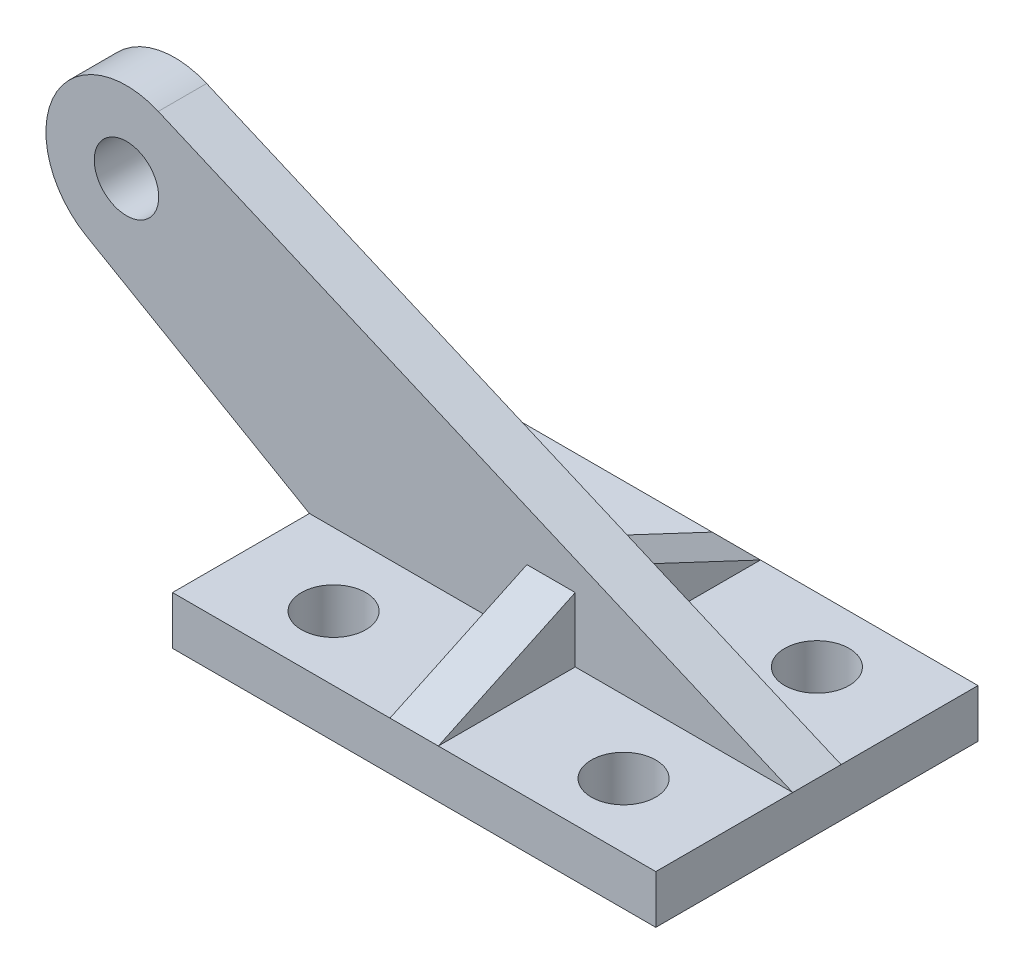
ISO-10303-21;
HEADER;
FILE_DESCRIPTION(('STEP AP214'),'2;1');
FILE_NAME('part.step','',(''),(''),'','','');
FILE_SCHEMA(('AUTOMOTIVE_DESIGN { 1 0 10303 214 1 1 1 1 }'));
ENDSEC;
DATA;
#1=APPLICATION_CONTEXT('core data for automotive mechanical design processes');
#2=APPLICATION_PROTOCOL_DEFINITION('international standard','automotive_design',2000,#1);
#3=PRODUCT_CONTEXT('',#1,'mechanical');
#4=PRODUCT('Part','Part','',(#3));
#5=PRODUCT_RELATED_PRODUCT_CATEGORY('part','',(#4));
#6=PRODUCT_DEFINITION_FORMATION('','',#4);
#7=PRODUCT_DEFINITION_CONTEXT('part definition',#1,'design');
#8=PRODUCT_DEFINITION('design','',#6,#7);
#9=PRODUCT_DEFINITION_SHAPE('','',#8);
#10=(LENGTH_UNIT() NAMED_UNIT(*) SI_UNIT(.MILLI.,.METRE.));
#11=(NAMED_UNIT(*) PLANE_ANGLE_UNIT() SI_UNIT($,.RADIAN.));
#12=(NAMED_UNIT(*) SI_UNIT($,.STERADIAN.) SOLID_ANGLE_UNIT());
#13=UNCERTAINTY_MEASURE_WITH_UNIT(LENGTH_MEASURE(1.E-05),#10,'distance_accuracy_value','');
#14=(GEOMETRIC_REPRESENTATION_CONTEXT(3) GLOBAL_UNCERTAINTY_ASSIGNED_CONTEXT((#13)) GLOBAL_UNIT_ASSIGNED_CONTEXT((#10,
#11,#12)) REPRESENTATION_CONTEXT('',''));
#15=CARTESIAN_POINT('',(0.,0.,0.));
#16=DIRECTION('',(0.,0.,1.));
#17=DIRECTION('',(1.,0.,0.));
#18=AXIS2_PLACEMENT_3D('',#15,#16,#17);
#19=CARTESIAN_POINT('',(0.,15.,0.));
#20=DIRECTION('',(0.,-1.,0.));
#21=DIRECTION('',(0.,0.,-1.));
#22=AXIS2_PLACEMENT_3D('',#19,#20,#21);
#23=PLANE('',#22);
#24=CARTESIAN_POINT('',(45.,15.,-30.));
#25=DIRECTION('',(0.,1.,0.));
#26=DIRECTION('',(0.,0.,1.));
#27=AXIS2_PLACEMENT_3D('',#24,#25,#26);
#28=CIRCLE('',#27,10.);
#29=CARTESIAN_POINT('',(45.,15.,-20.));
#30=VERTEX_POINT('',#29);
#31=EDGE_CURVE('E302',#30,#30,#28,.T.);
#32=ORIENTED_EDGE('',*,*,#31,.F.);
#33=EDGE_LOOP('',(#32));
#34=FACE_BOUND('',#33,.T.);
#35=DIRECTION('',(0.,0.,-1.));
#36=VECTOR('',#35,1.);
#37=CARTESIAN_POINT('',(7.5,15.,-7.5));
#38=LINE('',#37,#36);
#39=CARTESIAN_POINT('',(7.5,15.,-7.5));
#40=VERTEX_POINT('',#39);
#41=CARTESIAN_POINT('',(7.5,15.,-50.));
#42=VERTEX_POINT('',#41);
#43=EDGE_CURVE('E158',#40,#42,#38,.T.);
#44=ORIENTED_EDGE('',*,*,#43,.F.);
#45=DIRECTION('',(1.,0.,0.));
#46=VECTOR('',#45,1.);
#47=CARTESIAN_POINT('',(75.,15.,-7.5));
#48=LINE('',#47,#46);
#49=CARTESIAN_POINT('',(75.,15.,-7.5));
#50=VERTEX_POINT('',#49);
#51=EDGE_CURVE('E277',#40,#50,#48,.T.);
#52=ORIENTED_EDGE('',*,*,#51,.T.);
#53=DIRECTION('',(0.,0.,-1.));
#54=VECTOR('',#53,1.);
#55=CARTESIAN_POINT('',(75.,15.,50.));
#56=LINE('',#55,#54);
#57=CARTESIAN_POINT('',(75.,15.,-50.));
#58=VERTEX_POINT('',#57);
#59=EDGE_CURVE('E178',#50,#58,#56,.T.);
#60=ORIENTED_EDGE('',*,*,#59,.T.);
#61=DIRECTION('',(-1.,0.,0.));
#62=VECTOR('',#61,1.);
#63=CARTESIAN_POINT('',(-75.,15.,-50.));
#64=LINE('',#63,#62);
#65=EDGE_CURVE('E171',#58,#42,#64,.T.);
#66=ORIENTED_EDGE('',*,*,#65,.T.);
#67=EDGE_LOOP('',(#44,#52,#60,#66));
#68=FACE_BOUND('',#67,.T.);
#69=ADVANCED_FACE('F45',(#34,#68),#23,.F.);
#70=CARTESIAN_POINT('',(-131.782032302755,76.650635094611,-7.5));
#71=DIRECTION('',(0.,0.,1.));
#72=DIRECTION('',(1.,0.,0.));
#73=AXIS2_PLACEMENT_3D('',#70,#71,#72);
#74=PLANE('',#73);
#75=CARTESIAN_POINT('',(-131.782032302755,76.650635094611,-7.5));
#76=DIRECTION('',(0.,0.,1.));
#77=DIRECTION('',(1.,0.,0.));
#78=AXIS2_PLACEMENT_3D('',#75,#76,#77);
#79=CIRCLE('',#78,9.99999999999999);
#80=CARTESIAN_POINT('',(-121.782032302755,76.650635094611,-7.5));
#81=VERTEX_POINT('',#80);
#82=EDGE_CURVE('E247',#81,#81,#79,.T.);
#83=ORIENTED_EDGE('',*,*,#82,.T.);
#84=EDGE_LOOP('',(#83));
#85=FACE_BOUND('',#84,.T.);
#86=DIRECTION('',(0.,-1.,0.));
#87=VECTOR('',#86,1.);
#88=CARTESIAN_POINT('',(7.5,35.,-7.5));
#89=LINE('',#88,#87);
#90=CARTESIAN_POINT('',(7.5,35.,-7.5));
#91=VERTEX_POINT('',#90);
#92=EDGE_CURVE('E157',#91,#40,#89,.T.);
#93=ORIENTED_EDGE('',*,*,#92,.F.);
#94=DIRECTION('',(-1.,0.,0.));
#95=VECTOR('',#94,1.);
#96=CARTESIAN_POINT('',(7.5,35.,-7.5));
#97=LINE('',#96,#95);
#98=CARTESIAN_POINT('',(-7.5,35.,-7.5));
#99=VERTEX_POINT('',#98);
#100=EDGE_CURVE('E154',#91,#99,#97,.T.);
#101=ORIENTED_EDGE('',*,*,#100,.T.);
#102=DIRECTION('',(0.,-1.,0.));
#103=VECTOR('',#102,1.);
#104=CARTESIAN_POINT('',(-7.5,35.,-7.5));
#105=LINE('',#104,#103);
#106=CARTESIAN_POINT('',(-7.50000000000001,15.,-7.5));
#107=VERTEX_POINT('',#106);
#108=EDGE_CURVE('E165',#99,#107,#105,.T.);
#109=ORIENTED_EDGE('',*,*,#108,.T.);
#110=CARTESIAN_POINT('',(-75.,15.,-7.5));
#111=VERTEX_POINT('',#110);
#112=EDGE_CURVE('E263',#111,#107,#48,.T.);
#113=ORIENTED_EDGE('',*,*,#112,.F.);
#114=DIRECTION('',(0.866025403784438,-0.500000000000001,0.));
#115=VECTOR('',#114,1.);
#116=CARTESIAN_POINT('',(-75.,15.,-7.5));
#117=LINE('',#116,#115);
#118=CARTESIAN_POINT('',(-144.282032302755,55.0000000000001,-7.5));
#119=VERTEX_POINT('',#118);
#120=EDGE_CURVE('E274',#119,#111,#117,.T.);
#121=ORIENTED_EDGE('',*,*,#120,.F.);
#122=CARTESIAN_POINT('',(-131.782032302755,76.650635094611,-7.5));
#123=DIRECTION('',(0.,0.,1.));
#124=DIRECTION('',(1.,0.,0.));
#125=AXIS2_PLACEMENT_3D('',#122,#123,#124);
#126=CIRCLE('',#125,25.);
#127=CARTESIAN_POINT('',(-121.911493446378,99.6195807100445,-7.5));
#128=VERTEX_POINT('',#127);
#129=EDGE_CURVE('E272',#128,#119,#126,.T.);
#130=ORIENTED_EDGE('',*,*,#129,.F.);
#131=DIRECTION('',(-0.91875782461734,0.394821554255101,0.));
#132=VECTOR('',#131,1.);
#133=CARTESIAN_POINT('',(-121.911493446378,99.6195807100445,-7.5));
#134=LINE('',#133,#132);
#135=EDGE_CURVE('E257',#50,#128,#134,.T.);
#136=ORIENTED_EDGE('',*,*,#135,.F.);
#137=ORIENTED_EDGE('',*,*,#51,.F.);
#138=EDGE_LOOP('',(#93,#101,#109,#113,#121,#130,#136,#137));
#139=FACE_BOUND('',#138,.T.);
#140=ADVANCED_FACE('F328',(#85,#139),#74,.F.);
#141=CARTESIAN_POINT('',(45.,15.,30.));
#142=DIRECTION('',(0.,1.,0.));
#143=DIRECTION('',(0.,0.,1.));
#144=AXIS2_PLACEMENT_3D('',#141,#142,#143);
#145=CIRCLE('',#144,9.99999999999999);
#146=CARTESIAN_POINT('',(45.,15.,40.));
#147=VERTEX_POINT('',#146);
#148=EDGE_CURVE('E296',#147,#147,#145,.T.);
#149=ORIENTED_EDGE('',*,*,#148,.F.);
#150=EDGE_LOOP('',(#149));
#151=FACE_BOUND('',#150,.T.);
#152=DIRECTION('',(0.,0.,-1.));
#153=VECTOR('',#152,1.);
#154=CARTESIAN_POINT('',(7.5,15.,7.5));
#155=LINE('',#154,#153);
#156=CARTESIAN_POINT('',(7.49999999999999,15.,50.));
#157=VERTEX_POINT('',#156);
#158=CARTESIAN_POINT('',(7.50000000000001,15.,7.5));
#159=VERTEX_POINT('',#158);
#160=EDGE_CURVE('E68',#157,#159,#155,.T.);
#161=ORIENTED_EDGE('',*,*,#160,.F.);
#162=DIRECTION('',(1.,0.,0.));
#163=VECTOR('',#162,1.);
#164=CARTESIAN_POINT('',(-75.,15.,50.));
#165=LINE('',#164,#163);
#166=CARTESIAN_POINT('',(75.,15.,50.));
#167=VERTEX_POINT('',#166);
#168=EDGE_CURVE('E188',#157,#167,#165,.T.);
#169=ORIENTED_EDGE('',*,*,#168,.T.);
#170=CARTESIAN_POINT('',(75.,15.,7.5));
#171=VERTEX_POINT('',#170);
#172=EDGE_CURVE('E183',#167,#171,#56,.T.);
#173=ORIENTED_EDGE('',*,*,#172,.T.);
#174=DIRECTION('',(1.,0.,0.));
#175=VECTOR('',#174,1.);
#176=CARTESIAN_POINT('',(75.,15.,7.5));
#177=LINE('',#176,#175);
#178=EDGE_CURVE('E230',#159,#171,#177,.T.);
#179=ORIENTED_EDGE('',*,*,#178,.F.);
#180=EDGE_LOOP('',(#161,#169,#173,#179));
#181=FACE_BOUND('',#180,.T.);
#182=ADVANCED_FACE('F229',(#151,#181),#23,.F.);
#183=CARTESIAN_POINT('',(-131.782032302755,76.650635094611,7.5));
#184=DIRECTION('',(0.,0.,1.));
#185=DIRECTION('',(1.,0.,0.));
#186=AXIS2_PLACEMENT_3D('',#183,#184,#185);
#187=PLANE('',#186);
#188=CARTESIAN_POINT('',(-131.782032302755,76.650635094611,7.5));
#189=DIRECTION('',(0.,0.,1.));
#190=DIRECTION('',(1.,0.,0.));
#191=AXIS2_PLACEMENT_3D('',#188,#189,#190);
#192=CIRCLE('',#191,9.99999999999999);
#193=CARTESIAN_POINT('',(-121.782032302755,76.650635094611,7.5));
#194=VERTEX_POINT('',#193);
#195=EDGE_CURVE('E251',#194,#194,#192,.T.);
#196=ORIENTED_EDGE('',*,*,#195,.F.);
#197=EDGE_LOOP('',(#196));
#198=FACE_BOUND('',#197,.T.);
#199=DIRECTION('',(-1.,0.,0.));
#200=VECTOR('',#199,1.);
#201=CARTESIAN_POINT('',(7.5,35.,7.5));
#202=LINE('',#201,#200);
#203=CARTESIAN_POINT('',(7.50000000000001,35.,7.5));
#204=VERTEX_POINT('',#203);
#205=CARTESIAN_POINT('',(-7.50000000000001,35.,7.5));
#206=VERTEX_POINT('',#205);
#207=EDGE_CURVE('E248',#204,#206,#202,.T.);
#208=ORIENTED_EDGE('',*,*,#207,.F.);
#209=DIRECTION('',(0.,1.,0.));
#210=VECTOR('',#209,1.);
#211=CARTESIAN_POINT('',(7.5,35.,7.5));
#212=LINE('',#211,#210);
#213=EDGE_CURVE('E239',#159,#204,#212,.T.);
#214=ORIENTED_EDGE('',*,*,#213,.F.);
#215=ORIENTED_EDGE('',*,*,#178,.T.);
#216=DIRECTION('',(-0.91875782461734,0.394821554255101,0.));
#217=VECTOR('',#216,1.);
#218=CARTESIAN_POINT('',(-121.911493446378,99.6195807100445,7.5));
#219=LINE('',#218,#217);
#220=CARTESIAN_POINT('',(-121.911493446378,99.6195807100445,7.5));
#221=VERTEX_POINT('',#220);
#222=EDGE_CURVE('E259',#171,#221,#219,.T.);
#223=ORIENTED_EDGE('',*,*,#222,.T.);
#224=CARTESIAN_POINT('',(-131.782032302755,76.650635094611,7.5));
#225=DIRECTION('',(0.,0.,1.));
#226=DIRECTION('',(1.,0.,0.));
#227=AXIS2_PLACEMENT_3D('',#224,#225,#226);
#228=CIRCLE('',#227,25.);
#229=CARTESIAN_POINT('',(-144.282032302755,55.0000000000001,7.5));
#230=VERTEX_POINT('',#229);
#231=EDGE_CURVE('E262',#221,#230,#228,.T.);
#232=ORIENTED_EDGE('',*,*,#231,.T.);
#233=DIRECTION('',(0.866025403784438,-0.500000000000001,0.));
#234=VECTOR('',#233,1.);
#235=CARTESIAN_POINT('',(-75.,15.,7.5));
#236=LINE('',#235,#234);
#237=CARTESIAN_POINT('',(-75.,15.,7.5));
#238=VERTEX_POINT('',#237);
#239=EDGE_CURVE('E265',#230,#238,#236,.T.);
#240=ORIENTED_EDGE('',*,*,#239,.T.);
#241=CARTESIAN_POINT('',(-7.5,15.,7.5));
#242=VERTEX_POINT('',#241);
#243=EDGE_CURVE('E268',#238,#242,#177,.T.);
#244=ORIENTED_EDGE('',*,*,#243,.T.);
#245=DIRECTION('',(0.,1.,0.));
#246=VECTOR('',#245,1.);
#247=CARTESIAN_POINT('',(-7.5,35.,7.5));
#248=LINE('',#247,#246);
#249=EDGE_CURVE('E242',#242,#206,#248,.T.);
#250=ORIENTED_EDGE('',*,*,#249,.T.);
#251=EDGE_LOOP('',(#208,#214,#215,#223,#232,#240,#244,#250));
#252=FACE_BOUND('',#251,.T.);
#253=ADVANCED_FACE('F339',(#198,#252),#187,.T.);
#254=CARTESIAN_POINT('',(-45.,15.,30.));
#255=DIRECTION('',(0.,1.,0.));
#256=DIRECTION('',(0.,0.,1.));
#257=AXIS2_PLACEMENT_3D('',#254,#255,#256);
#258=CIRCLE('',#257,10.);
#259=CARTESIAN_POINT('',(-45.,15.,40.));
#260=VERTEX_POINT('',#259);
#261=EDGE_CURVE('E290',#260,#260,#258,.T.);
#262=ORIENTED_EDGE('',*,*,#261,.F.);
#263=EDGE_LOOP('',(#262));
#264=FACE_BOUND('',#263,.T.);
#265=CARTESIAN_POINT('',(-75.,15.,50.));
#266=VERTEX_POINT('',#265);
#267=CARTESIAN_POINT('',(-7.49999999999999,15.,50.));
#268=VERTEX_POINT('',#267);
#269=EDGE_CURVE('E189',#266,#268,#165,.T.);
#270=ORIENTED_EDGE('',*,*,#269,.T.);
#271=DIRECTION('',(0.,0.,-1.));
#272=VECTOR('',#271,1.);
#273=CARTESIAN_POINT('',(-7.5,15.,7.5));
#274=LINE('',#273,#272);
#275=EDGE_CURVE('E364',#268,#242,#274,.T.);
#276=ORIENTED_EDGE('',*,*,#275,.T.);
#277=ORIENTED_EDGE('',*,*,#243,.F.);
#278=DIRECTION('',(0.,0.,1.));
#279=VECTOR('',#278,1.);
#280=CARTESIAN_POINT('',(-75.,15.,50.));
#281=LINE('',#280,#279);
#282=EDGE_CURVE('E179',#238,#266,#281,.T.);
#283=ORIENTED_EDGE('',*,*,#282,.T.);
#284=EDGE_LOOP('',(#270,#276,#277,#283));
#285=FACE_BOUND('',#284,.T.);
#286=ADVANCED_FACE('F341',(#264,#285),#23,.F.);
#287=ORIENTED_EDGE('',*,*,#112,.T.);
#288=DIRECTION('',(0.,0.,-1.));
#289=VECTOR('',#288,1.);
#290=CARTESIAN_POINT('',(-7.5,15.,-7.5));
#291=LINE('',#290,#289);
#292=CARTESIAN_POINT('',(-7.5,15.,-50.));
#293=VERTEX_POINT('',#292);
#294=EDGE_CURVE('E60',#107,#293,#291,.T.);
#295=ORIENTED_EDGE('',*,*,#294,.T.);
#296=CARTESIAN_POINT('',(-75.,15.,-50.));
#297=VERTEX_POINT('',#296);
#298=EDGE_CURVE('E174',#293,#297,#64,.T.);
#299=ORIENTED_EDGE('',*,*,#298,.T.);
#300=EDGE_CURVE('E181',#297,#111,#281,.T.);
#301=ORIENTED_EDGE('',*,*,#300,.T.);
#302=EDGE_LOOP('',(#287,#295,#299,#301));
#303=FACE_BOUND('',#302,.T.);
#304=CARTESIAN_POINT('',(-45.,15.,-30.));
#305=DIRECTION('',(0.,1.,0.));
#306=DIRECTION('',(0.,0.,1.));
#307=AXIS2_PLACEMENT_3D('',#304,#305,#306);
#308=CIRCLE('',#307,10.);
#309=CARTESIAN_POINT('',(-45.,15.,-20.));
#310=VERTEX_POINT('',#309);
#311=EDGE_CURVE('E197',#310,#310,#308,.T.);
#312=ORIENTED_EDGE('',*,*,#311,.F.);
#313=EDGE_LOOP('',(#312));
#314=FACE_BOUND('',#313,.T.);
#315=ADVANCED_FACE('F330',(#303,#314),#23,.F.);
#316=CARTESIAN_POINT('',(0.,0.,0.));
#317=DIRECTION('',(0.,-1.,0.));
#318=DIRECTION('',(0.,0.,-1.));
#319=AXIS2_PLACEMENT_3D('',#316,#317,#318);
#320=PLANE('',#319);
#321=CARTESIAN_POINT('',(45.,0.,30.));
#322=DIRECTION('',(0.,1.,0.));
#323=DIRECTION('',(0.,0.,1.));
#324=AXIS2_PLACEMENT_3D('',#321,#322,#323);
#325=CIRCLE('',#324,9.99999999999999);
#326=CARTESIAN_POINT('',(45.,0.,40.));
#327=VERTEX_POINT('',#326);
#328=EDGE_CURVE('E293',#327,#327,#325,.T.);
#329=ORIENTED_EDGE('',*,*,#328,.T.);
#330=EDGE_LOOP('',(#329));
#331=FACE_BOUND('',#330,.T.);
#332=CARTESIAN_POINT('',(-45.,0.,-30.));
#333=DIRECTION('',(0.,1.,0.));
#334=DIRECTION('',(0.,0.,1.));
#335=AXIS2_PLACEMENT_3D('',#332,#333,#334);
#336=CIRCLE('',#335,10.);
#337=CARTESIAN_POINT('',(-45.,0.,-20.));
#338=VERTEX_POINT('',#337);
#339=EDGE_CURVE('E305',#338,#338,#336,.T.);
#340=ORIENTED_EDGE('',*,*,#339,.T.);
#341=EDGE_LOOP('',(#340));
#342=FACE_BOUND('',#341,.T.);
#343=DIRECTION('',(0.,0.,-1.));
#344=VECTOR('',#343,1.);
#345=CARTESIAN_POINT('',(75.,0.,50.));
#346=LINE('',#345,#344);
#347=CARTESIAN_POINT('',(75.,0.,50.));
#348=VERTEX_POINT('',#347);
#349=CARTESIAN_POINT('',(75.,0.,-50.));
#350=VERTEX_POINT('',#349);
#351=EDGE_CURVE('E193',#348,#350,#346,.T.);
#352=ORIENTED_EDGE('',*,*,#351,.F.);
#353=DIRECTION('',(1.,0.,0.));
#354=VECTOR('',#353,1.);
#355=CARTESIAN_POINT('',(-75.,0.,50.));
#356=LINE('',#355,#354);
#357=CARTESIAN_POINT('',(-75.,0.,50.));
#358=VERTEX_POINT('',#357);
#359=EDGE_CURVE('E201',#358,#348,#356,.T.);
#360=ORIENTED_EDGE('',*,*,#359,.F.);
#361=DIRECTION('',(0.,0.,1.));
#362=VECTOR('',#361,1.);
#363=CARTESIAN_POINT('',(-75.,0.,50.));
#364=LINE('',#363,#362);
#365=CARTESIAN_POINT('',(-75.,0.,-50.));
#366=VERTEX_POINT('',#365);
#367=EDGE_CURVE('E199',#366,#358,#364,.T.);
#368=ORIENTED_EDGE('',*,*,#367,.F.);
#369=DIRECTION('',(-1.,0.,0.));
#370=VECTOR('',#369,1.);
#371=CARTESIAN_POINT('',(-75.,0.,-50.));
#372=LINE('',#371,#370);
#373=EDGE_CURVE('E196',#350,#366,#372,.T.);
#374=ORIENTED_EDGE('',*,*,#373,.F.);
#375=EDGE_LOOP('',(#352,#360,#368,#374));
#376=FACE_BOUND('',#375,.T.);
#377=CARTESIAN_POINT('',(45.,0.,-30.));
#378=DIRECTION('',(0.,1.,0.));
#379=DIRECTION('',(0.,0.,1.));
#380=AXIS2_PLACEMENT_3D('',#377,#378,#379);
#381=CIRCLE('',#380,10.);
#382=CARTESIAN_POINT('',(45.,0.,-20.));
#383=VERTEX_POINT('',#382);
#384=EDGE_CURVE('E299',#383,#383,#381,.T.);
#385=ORIENTED_EDGE('',*,*,#384,.T.);
#386=EDGE_LOOP('',(#385));
#387=FACE_BOUND('',#386,.T.);
#388=CARTESIAN_POINT('',(-45.,0.,30.));
#389=DIRECTION('',(0.,1.,0.));
#390=DIRECTION('',(0.,0.,1.));
#391=AXIS2_PLACEMENT_3D('',#388,#389,#390);
#392=CIRCLE('',#391,10.);
#393=CARTESIAN_POINT('',(-45.,0.,40.));
#394=VERTEX_POINT('',#393);
#395=EDGE_CURVE('E289',#394,#394,#392,.T.);
#396=ORIENTED_EDGE('',*,*,#395,.T.);
#397=EDGE_LOOP('',(#396));
#398=FACE_BOUND('',#397,.T.);
#399=ADVANCED_FACE('F216',(#331,#342,#376,#387,#398),#320,.T.);
#400=CARTESIAN_POINT('',(75.,15.,50.));
#401=DIRECTION('',(-1.,0.,0.));
#402=DIRECTION('',(0.,0.,1.));
#403=AXIS2_PLACEMENT_3D('',#400,#401,#402);
#404=PLANE('',#403);
#405=ORIENTED_EDGE('',*,*,#351,.T.);
#406=DIRECTION('',(0.,-1.,0.));
#407=VECTOR('',#406,1.);
#408=CARTESIAN_POINT('',(75.,15.,-50.));
#409=LINE('',#408,#407);
#410=EDGE_CURVE('E13',#58,#350,#409,.T.);
#411=ORIENTED_EDGE('',*,*,#410,.F.);
#412=ORIENTED_EDGE('',*,*,#59,.F.);
#413=DIRECTION('',(0.,0.,-1.));
#414=VECTOR('',#413,1.);
#415=CARTESIAN_POINT('',(75.,15.,7.5));
#416=LINE('',#415,#414);
#417=EDGE_CURVE('E227',#171,#50,#416,.T.);
#418=ORIENTED_EDGE('',*,*,#417,.F.);
#419=ORIENTED_EDGE('',*,*,#172,.F.);
#420=DIRECTION('',(0.,-1.,0.));
#421=VECTOR('',#420,1.);
#422=CARTESIAN_POINT('',(75.,15.,50.));
#423=LINE('',#422,#421);
#424=EDGE_CURVE('E192',#167,#348,#423,.T.);
#425=ORIENTED_EDGE('',*,*,#424,.T.);
#426=EDGE_LOOP('',(#405,#411,#412,#418,#419,#425));
#427=FACE_BOUND('',#426,.T.);
#428=ADVANCED_FACE('F47',(#427),#404,.F.);
#429=CARTESIAN_POINT('',(-75.,15.,-50.));
#430=DIRECTION('',(0.,0.,1.));
#431=DIRECTION('',(1.,0.,0.));
#432=AXIS2_PLACEMENT_3D('',#429,#430,#431);
#433=PLANE('',#432);
#434=ORIENTED_EDGE('',*,*,#373,.T.);
#435=DIRECTION('',(0.,-1.,0.));
#436=VECTOR('',#435,1.);
#437=CARTESIAN_POINT('',(-75.,15.,-50.));
#438=LINE('',#437,#436);
#439=EDGE_CURVE('E53',#297,#366,#438,.T.);
#440=ORIENTED_EDGE('',*,*,#439,.F.);
#441=ORIENTED_EDGE('',*,*,#298,.F.);
#442=DIRECTION('',(-1.,0.,0.));
#443=VECTOR('',#442,1.);
#444=CARTESIAN_POINT('',(7.5,15.,-50.));
#445=LINE('',#444,#443);
#446=EDGE_CURVE('E152',#42,#293,#445,.T.);
#447=ORIENTED_EDGE('',*,*,#446,.F.);
#448=ORIENTED_EDGE('',*,*,#65,.F.);
#449=ORIENTED_EDGE('',*,*,#410,.T.);
#450=EDGE_LOOP('',(#434,#440,#441,#447,#448,#449));
#451=FACE_BOUND('',#450,.T.);
#452=ADVANCED_FACE('F170',(#451),#433,.F.);
#453=CARTESIAN_POINT('',(-75.,15.,50.));
#454=DIRECTION('',(1.,0.,0.));
#455=DIRECTION('',(0.,0.,-1.));
#456=AXIS2_PLACEMENT_3D('',#453,#454,#455);
#457=PLANE('',#456);
#458=ORIENTED_EDGE('',*,*,#367,.T.);
#459=DIRECTION('',(0.,-1.,0.));
#460=VECTOR('',#459,1.);
#461=CARTESIAN_POINT('',(-75.,15.,50.));
#462=LINE('',#461,#460);
#463=EDGE_CURVE('E205',#266,#358,#462,.T.);
#464=ORIENTED_EDGE('',*,*,#463,.F.);
#465=ORIENTED_EDGE('',*,*,#282,.F.);
#466=DIRECTION('',(0.,0.,-1.));
#467=VECTOR('',#466,1.);
#468=CARTESIAN_POINT('',(-75.,15.,7.5));
#469=LINE('',#468,#467);
#470=EDGE_CURVE('E281',#238,#111,#469,.T.);
#471=ORIENTED_EDGE('',*,*,#470,.T.);
#472=ORIENTED_EDGE('',*,*,#300,.F.);
#473=ORIENTED_EDGE('',*,*,#439,.T.);
#474=EDGE_LOOP('',(#458,#464,#465,#471,#472,#473));
#475=FACE_BOUND('',#474,.T.);
#476=ADVANCED_FACE('F211',(#475),#457,.F.);
#477=CARTESIAN_POINT('',(-75.,15.,50.));
#478=DIRECTION('',(0.,0.,-1.));
#479=DIRECTION('',(-1.,0.,0.));
#480=AXIS2_PLACEMENT_3D('',#477,#478,#479);
#481=PLANE('',#480);
#482=ORIENTED_EDGE('',*,*,#359,.T.);
#483=ORIENTED_EDGE('',*,*,#424,.F.);
#484=ORIENTED_EDGE('',*,*,#168,.F.);
#485=DIRECTION('',(-1.,0.,0.));
#486=VECTOR('',#485,1.);
#487=CARTESIAN_POINT('',(7.5,15.,50.));
#488=LINE('',#487,#486);
#489=EDGE_CURVE('E233',#157,#268,#488,.T.);
#490=ORIENTED_EDGE('',*,*,#489,.T.);
#491=ORIENTED_EDGE('',*,*,#269,.F.);
#492=ORIENTED_EDGE('',*,*,#463,.T.);
#493=EDGE_LOOP('',(#482,#483,#484,#490,#491,#492));
#494=FACE_BOUND('',#493,.T.);
#495=ADVANCED_FACE('F220',(#494),#481,.F.);
#496=CARTESIAN_POINT('',(-45.,15.,-30.));
#497=DIRECTION('',(0.,-1.,0.));
#498=DIRECTION('',(0.,0.,-1.));
#499=AXIS2_PLACEMENT_3D('',#496,#497,#498);
#500=CYLINDRICAL_SURFACE('',#499,10.);
#501=ORIENTED_EDGE('',*,*,#311,.T.);
#502=EDGE_LOOP('',(#501));
#503=FACE_BOUND('',#502,.T.);
#504=ORIENTED_EDGE('',*,*,#339,.F.);
#505=EDGE_LOOP('',(#504));
#506=FACE_BOUND('',#505,.T.);
#507=ADVANCED_FACE('F313',(#503,#506),#500,.F.);
#508=CARTESIAN_POINT('',(45.,15.,-30.));
#509=DIRECTION('',(0.,-1.,0.));
#510=DIRECTION('',(0.,0.,-1.));
#511=AXIS2_PLACEMENT_3D('',#508,#509,#510);
#512=CYLINDRICAL_SURFACE('',#511,10.);
#513=ORIENTED_EDGE('',*,*,#31,.T.);
#514=EDGE_LOOP('',(#513));
#515=FACE_BOUND('',#514,.T.);
#516=ORIENTED_EDGE('',*,*,#384,.F.);
#517=EDGE_LOOP('',(#516));
#518=FACE_BOUND('',#517,.T.);
#519=ADVANCED_FACE('F315',(#515,#518),#512,.F.);
#520=CARTESIAN_POINT('',(45.,15.,30.));
#521=DIRECTION('',(0.,-1.,0.));
#522=DIRECTION('',(0.,0.,-1.));
#523=AXIS2_PLACEMENT_3D('',#520,#521,#522);
#524=CYLINDRICAL_SURFACE('',#523,9.99999999999999);
#525=ORIENTED_EDGE('',*,*,#148,.T.);
#526=EDGE_LOOP('',(#525));
#527=FACE_BOUND('',#526,.T.);
#528=ORIENTED_EDGE('',*,*,#328,.F.);
#529=EDGE_LOOP('',(#528));
#530=FACE_BOUND('',#529,.T.);
#531=ADVANCED_FACE('F322',(#527,#530),#524,.F.);
#532=CARTESIAN_POINT('',(-45.,15.,30.));
#533=DIRECTION('',(0.,-1.,0.));
#534=DIRECTION('',(0.,0.,-1.));
#535=AXIS2_PLACEMENT_3D('',#532,#533,#534);
#536=CYLINDRICAL_SURFACE('',#535,10.);
#537=ORIENTED_EDGE('',*,*,#261,.T.);
#538=EDGE_LOOP('',(#537));
#539=FACE_BOUND('',#538,.T.);
#540=ORIENTED_EDGE('',*,*,#395,.F.);
#541=EDGE_LOOP('',(#540));
#542=FACE_BOUND('',#541,.T.);
#543=ADVANCED_FACE('F385',(#539,#542),#536,.F.);
#544=CARTESIAN_POINT('',(-121.911493446378,99.6195807100445,7.5));
#545=DIRECTION('',(-0.394821554255101,-0.91875782461734,0.));
#546=DIRECTION('',(0.91875782461734,-0.394821554255101,0.));
#547=AXIS2_PLACEMENT_3D('',#544,#545,#546);
#548=PLANE('',#547);
#549=ORIENTED_EDGE('',*,*,#135,.T.);
#550=DIRECTION('',(0.,0.,-1.));
#551=VECTOR('',#550,1.);
#552=CARTESIAN_POINT('',(-121.911493446378,99.6195807100445,7.5));
#553=LINE('',#552,#551);
#554=EDGE_CURVE('E286',#221,#128,#553,.T.);
#555=ORIENTED_EDGE('',*,*,#554,.F.);
#556=ORIENTED_EDGE('',*,*,#222,.F.);
#557=ORIENTED_EDGE('',*,*,#417,.T.);
#558=EDGE_LOOP('',(#549,#555,#556,#557));
#559=FACE_BOUND('',#558,.T.);
#560=ADVANCED_FACE('F383',(#559),#548,.F.);
#561=CARTESIAN_POINT('',(-131.782032302755,76.650635094611,7.5));
#562=DIRECTION('',(0.,0.,-1.));
#563=DIRECTION('',(-1.,0.,0.));
#564=AXIS2_PLACEMENT_3D('',#561,#562,#563);
#565=CYLINDRICAL_SURFACE('',#564,25.);
#566=ORIENTED_EDGE('',*,*,#129,.T.);
#567=DIRECTION('',(0.,0.,-1.));
#568=VECTOR('',#567,1.);
#569=CARTESIAN_POINT('',(-144.282032302755,55.0000000000001,7.5));
#570=LINE('',#569,#568);
#571=EDGE_CURVE('E283',#230,#119,#570,.T.);
#572=ORIENTED_EDGE('',*,*,#571,.F.);
#573=ORIENTED_EDGE('',*,*,#231,.F.);
#574=ORIENTED_EDGE('',*,*,#554,.T.);
#575=EDGE_LOOP('',(#566,#572,#573,#574));
#576=FACE_BOUND('',#575,.T.);
#577=ADVANCED_FACE('F379',(#576),#565,.T.);
#578=CARTESIAN_POINT('',(-75.,15.,7.5));
#579=DIRECTION('',(0.500000000000001,0.866025403784438,0.));
#580=DIRECTION('',(-0.866025403784438,0.500000000000001,0.));
#581=AXIS2_PLACEMENT_3D('',#578,#579,#580);
#582=PLANE('',#581);
#583=ORIENTED_EDGE('',*,*,#120,.T.);
#584=ORIENTED_EDGE('',*,*,#470,.F.);
#585=ORIENTED_EDGE('',*,*,#239,.F.);
#586=ORIENTED_EDGE('',*,*,#571,.T.);
#587=EDGE_LOOP('',(#583,#584,#585,#586));
#588=FACE_BOUND('',#587,.T.);
#589=ADVANCED_FACE('F377',(#588),#582,.F.);
#590=CARTESIAN_POINT('',(-131.782032302755,76.650635094611,7.5));
#591=DIRECTION('',(0.,0.,-1.));
#592=DIRECTION('',(-1.,0.,0.));
#593=AXIS2_PLACEMENT_3D('',#590,#591,#592);
#594=CYLINDRICAL_SURFACE('',#593,9.99999999999999);
#595=ORIENTED_EDGE('',*,*,#195,.T.);
#596=EDGE_LOOP('',(#595));
#597=FACE_BOUND('',#596,.T.);
#598=ORIENTED_EDGE('',*,*,#82,.F.);
#599=EDGE_LOOP('',(#598));
#600=FACE_BOUND('',#599,.T.);
#601=ADVANCED_FACE('F448',(#597,#600),#594,.F.);
#602=CARTESIAN_POINT('',(7.5,15.,50.));
#603=DIRECTION('',(0.,-0.904818702200994,-0.42579703632988));
#604=DIRECTION('',(0.,0.42579703632988,-0.904818702200994));
#605=AXIS2_PLACEMENT_3D('',#602,#603,#604);
#606=PLANE('',#605);
#607=DIRECTION('',(0.,-0.42579703632988,0.904818702200994));
#608=VECTOR('',#607,1.);
#609=CARTESIAN_POINT('',(-7.5,15.,50.));
#610=LINE('',#609,#608);
#611=EDGE_CURVE('E175',#206,#268,#610,.T.);
#612=ORIENTED_EDGE('',*,*,#611,.T.);
#613=ORIENTED_EDGE('',*,*,#489,.F.);
#614=DIRECTION('',(0.,-0.42579703632988,0.904818702200994));
#615=VECTOR('',#614,1.);
#616=CARTESIAN_POINT('',(7.5,15.,50.));
#617=LINE('',#616,#615);
#618=EDGE_CURVE('E237',#204,#157,#617,.T.);
#619=ORIENTED_EDGE('',*,*,#618,.F.);
#620=ORIENTED_EDGE('',*,*,#207,.T.);
#621=EDGE_LOOP('',(#612,#613,#619,#620));
#622=FACE_BOUND('',#621,.T.);
#623=ADVANCED_FACE('F245',(#622),#606,.F.);
#624=CARTESIAN_POINT('',(7.5,0.,0.));
#625=DIRECTION('',(-1.,0.,0.));
#626=DIRECTION('',(0.,0.,1.));
#627=AXIS2_PLACEMENT_3D('',#624,#625,#626);
#628=PLANE('',#627);
#629=ORIENTED_EDGE('',*,*,#618,.T.);
#630=ORIENTED_EDGE('',*,*,#160,.T.);
#631=ORIENTED_EDGE('',*,*,#213,.T.);
#632=EDGE_LOOP('',(#629,#630,#631));
#633=FACE_BOUND('',#632,.T.);
#634=ADVANCED_FACE('F238',(#633),#628,.F.);
#635=CARTESIAN_POINT('',(-7.5,0.,0.));
#636=DIRECTION('',(-1.,0.,0.));
#637=DIRECTION('',(0.,0.,1.));
#638=AXIS2_PLACEMENT_3D('',#635,#636,#637);
#639=PLANE('',#638);
#640=ORIENTED_EDGE('',*,*,#611,.F.);
#641=ORIENTED_EDGE('',*,*,#249,.F.);
#642=ORIENTED_EDGE('',*,*,#275,.F.);
#643=EDGE_LOOP('',(#640,#641,#642));
#644=FACE_BOUND('',#643,.T.);
#645=ADVANCED_FACE('F370',(#644),#639,.T.);
#646=CARTESIAN_POINT('',(7.5,15.,-50.));
#647=DIRECTION('',(0.,-0.904818702200994,0.425797036329879));
#648=DIRECTION('',(0.,-0.425797036329879,-0.904818702200994));
#649=AXIS2_PLACEMENT_3D('',#646,#647,#648);
#650=PLANE('',#649);
#651=DIRECTION('',(0.,0.425797036329879,0.904818702200994));
#652=VECTOR('',#651,1.);
#653=CARTESIAN_POINT('',(-7.5,15.,-50.));
#654=LINE('',#653,#652);
#655=EDGE_CURVE('E355',#293,#99,#654,.T.);
#656=ORIENTED_EDGE('',*,*,#655,.T.);
#657=ORIENTED_EDGE('',*,*,#100,.F.);
#658=DIRECTION('',(0.,0.425797036329879,0.904818702200994));
#659=VECTOR('',#658,1.);
#660=CARTESIAN_POINT('',(7.5,15.,-50.));
#661=LINE('',#660,#659);
#662=EDGE_CURVE('E148',#42,#91,#661,.T.);
#663=ORIENTED_EDGE('',*,*,#662,.F.);
#664=ORIENTED_EDGE('',*,*,#446,.T.);
#665=EDGE_LOOP('',(#656,#657,#663,#664));
#666=FACE_BOUND('',#665,.T.);
#667=ADVANCED_FACE('F150',(#666),#650,.F.);
#668=CARTESIAN_POINT('',(7.5,0.,0.));
#669=DIRECTION('',(-1.,0.,0.));
#670=DIRECTION('',(0.,0.,1.));
#671=AXIS2_PLACEMENT_3D('',#668,#669,#670);
#672=PLANE('',#671);
#673=ORIENTED_EDGE('',*,*,#43,.T.);
#674=ORIENTED_EDGE('',*,*,#662,.T.);
#675=ORIENTED_EDGE('',*,*,#92,.T.);
#676=EDGE_LOOP('',(#673,#674,#675));
#677=FACE_BOUND('',#676,.T.);
#678=ADVANCED_FACE('F161',(#677),#672,.F.);
#679=CARTESIAN_POINT('',(-7.5,0.,0.));
#680=DIRECTION('',(-1.,0.,0.));
#681=DIRECTION('',(0.,0.,1.));
#682=AXIS2_PLACEMENT_3D('',#679,#680,#681);
#683=PLANE('',#682);
#684=ORIENTED_EDGE('',*,*,#294,.F.);
#685=ORIENTED_EDGE('',*,*,#108,.F.);
#686=ORIENTED_EDGE('',*,*,#655,.F.);
#687=EDGE_LOOP('',(#684,#685,#686));
#688=FACE_BOUND('',#687,.T.);
#689=ADVANCED_FACE('F542',(#688),#683,.T.);
#690=CLOSED_SHELL('',(#69,#140,#182,#253,#286,#315,#399,#428,#452,#476,#495,#507,#519,#531,#543,
#560,#577,#589,#601,#623,#634,#645,#667,#678,#689));
#691=MANIFOLD_SOLID_BREP('B2',#690);
#692=ADVANCED_BREP_SHAPE_REPRESENTATION('',(#18,#691),#14);
#693=SHAPE_DEFINITION_REPRESENTATION(#9,#692);
ENDSEC;
END-ISO-10303-21;
